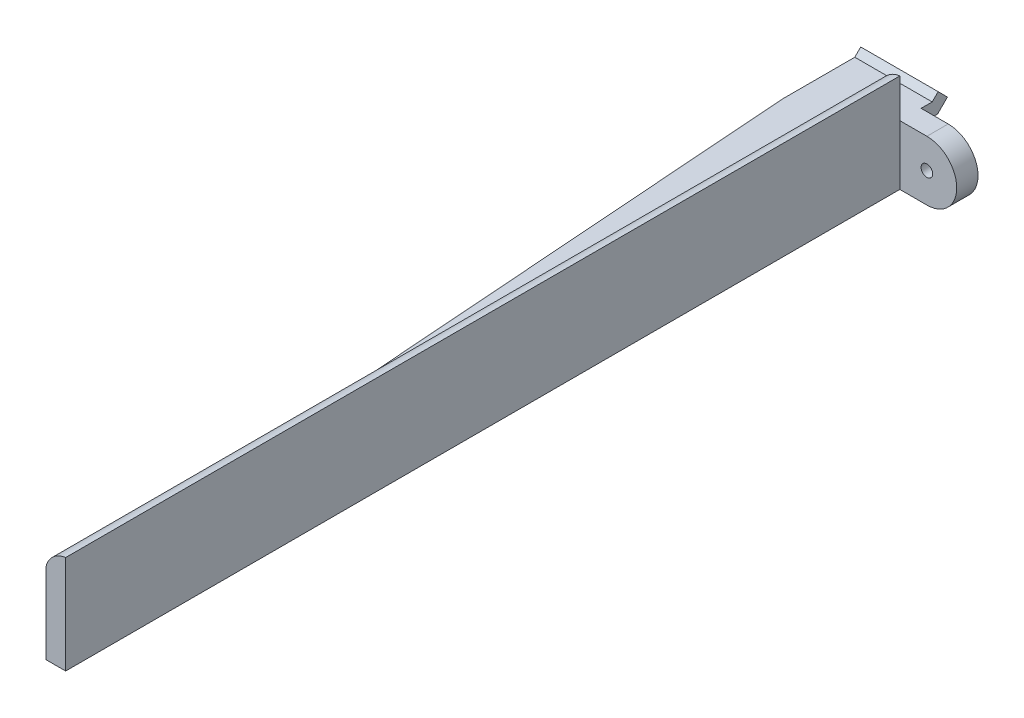
ISO-10303-21;
HEADER;
FILE_DESCRIPTION(('STEP AP214'),'2;1');
FILE_NAME('part.step','',(''),(''),'','','');
FILE_SCHEMA(('AUTOMOTIVE_DESIGN { 1 0 10303 214 1 1 1 1 }'));
ENDSEC;
DATA;
#1=APPLICATION_CONTEXT('core data for automotive mechanical design processes');
#2=APPLICATION_PROTOCOL_DEFINITION('international standard','automotive_design',2000,#1);
#3=PRODUCT_CONTEXT('',#1,'mechanical');
#4=PRODUCT('Part','Part','',(#3));
#5=PRODUCT_RELATED_PRODUCT_CATEGORY('part','',(#4));
#6=PRODUCT_DEFINITION_FORMATION('','',#4);
#7=PRODUCT_DEFINITION_CONTEXT('part definition',#1,'design');
#8=PRODUCT_DEFINITION('design','',#6,#7);
#9=PRODUCT_DEFINITION_SHAPE('','',#8);
#10=(LENGTH_UNIT() NAMED_UNIT(*) SI_UNIT(.MILLI.,.METRE.));
#11=(NAMED_UNIT(*) PLANE_ANGLE_UNIT() SI_UNIT($,.RADIAN.));
#12=(NAMED_UNIT(*) SI_UNIT($,.STERADIAN.) SOLID_ANGLE_UNIT());
#13=UNCERTAINTY_MEASURE_WITH_UNIT(LENGTH_MEASURE(1.E-05),#10,'distance_accuracy_value','');
#14=(GEOMETRIC_REPRESENTATION_CONTEXT(3) GLOBAL_UNCERTAINTY_ASSIGNED_CONTEXT((#13)) GLOBAL_UNIT_ASSIGNED_CONTEXT((#10,
#11,#12)) REPRESENTATION_CONTEXT('',''));
#15=CARTESIAN_POINT('',(0.,0.,0.));
#16=DIRECTION('',(0.,0.,1.));
#17=DIRECTION('',(1.,0.,0.));
#18=AXIS2_PLACEMENT_3D('',#15,#16,#17);
#19=CARTESIAN_POINT('',(9.20199597764665,5.77025558493723,-0.150000000000021));
#20=DIRECTION('',(0.,1.,0.));
#21=DIRECTION('',(0.,0.,1.));
#22=AXIS2_PLACEMENT_3D('',#19,#20,#21);
#23=PLANE('',#22);
#24=DIRECTION('',(-0.0725670682557861,0.,-0.997363534828079));
#25=VECTOR('',#24,1.);
#26=CARTESIAN_POINT('',(-5.,5.77025558493723,7.95281056443287));
#27=LINE('',#26,#25);
#28=CARTESIAN_POINT('',(-0.538779857745085,5.77025558493723,69.2679277060271));
#29=VERTEX_POINT('',#28);
#30=CARTESIAN_POINT('',(-5.,5.77025558493723,7.95281056443287));
#31=VERTEX_POINT('',#30);
#32=EDGE_CURVE('E184',#29,#31,#27,.T.);
#33=ORIENTED_EDGE('',*,*,#32,.F.);
#34=DIRECTION('',(0.,0.,1.));
#35=VECTOR('',#34,1.);
#36=CARTESIAN_POINT('',(-0.538779857745083,5.77025558493723,-0.150000000000021));
#37=LINE('',#36,#35);
#38=CARTESIAN_POINT('',(-0.538779857745082,5.77025558493723,2.74552308366083));
#39=VERTEX_POINT('',#38);
#40=EDGE_CURVE('E316',#29,#39,#37,.F.);
#41=ORIENTED_EDGE('',*,*,#40,.T.);
#42=DIRECTION('',(-1.,0.,0.));
#43=VECTOR('',#42,1.);
#44=CARTESIAN_POINT('',(5.,5.77025558493723,2.74552308366083));
#45=LINE('',#44,#43);
#46=CARTESIAN_POINT('',(5.,5.77025558493723,2.74552308366083));
#47=VERTEX_POINT('',#46);
#48=EDGE_CURVE('E188',#47,#39,#45,.T.);
#49=ORIENTED_EDGE('',*,*,#48,.F.);
#50=DIRECTION('',(0.,0.,-1.));
#51=VECTOR('',#50,1.);
#52=CARTESIAN_POINT('',(5.,5.77025558493723,110.5));
#53=LINE('',#52,#51);
#54=CARTESIAN_POINT('',(5.,5.77025558493723,2.74999999999999));
#55=VERTEX_POINT('',#54);
#56=EDGE_CURVE('E183',#55,#47,#53,.T.);
#57=ORIENTED_EDGE('',*,*,#56,.F.);
#58=DIRECTION('',(-1.,0.,0.));
#59=VECTOR('',#58,1.);
#60=CARTESIAN_POINT('',(5.,5.7702555849373,2.75));
#61=LINE('',#60,#59);
#62=CARTESIAN_POINT('',(8.5,5.7702555849373,2.75));
#63=VERTEX_POINT('',#62);
#64=EDGE_CURVE('E204',#63,#55,#61,.T.);
#65=ORIENTED_EDGE('',*,*,#64,.F.);
#66=DIRECTION('',(0.,0.,-1.));
#67=VECTOR('',#66,1.);
#68=CARTESIAN_POINT('',(8.5,5.7702555849373,13.3948344279941));
#69=LINE('',#68,#67);
#70=CARTESIAN_POINT('',(8.5,5.7702555849373,0.));
#71=VERTEX_POINT('',#70);
#72=EDGE_CURVE('E231',#63,#71,#69,.T.);
#73=ORIENTED_EDGE('',*,*,#72,.T.);
#74=DIRECTION('',(-1.,0.,0.));
#75=VECTOR('',#74,1.);
#76=CARTESIAN_POINT('',(5.,5.7702555849373,0.));
#77=LINE('',#76,#75);
#78=CARTESIAN_POINT('',(5.,5.77025558493723,0.));
#79=VERTEX_POINT('',#78);
#80=EDGE_CURVE('E228',#71,#79,#77,.T.);
#81=ORIENTED_EDGE('',*,*,#80,.T.);
#82=DIRECTION('',(0.,0.,1.));
#83=VECTOR('',#82,1.);
#84=CARTESIAN_POINT('',(5.,5.77025558493723,-0.150000000000021));
#85=LINE('',#84,#83);
#86=CARTESIAN_POINT('',(5.,5.77025558493723,-1.43370490960982));
#87=VERTEX_POINT('',#86);
#88=EDGE_CURVE('E285',#87,#79,#85,.T.);
#89=ORIENTED_EDGE('',*,*,#88,.F.);
#90=DIRECTION('',(-1.,0.,0.));
#91=VECTOR('',#90,1.);
#92=CARTESIAN_POINT('',(9.20199597764665,5.77025558493723,-1.43370490960982));
#93=LINE('',#92,#91);
#94=CARTESIAN_POINT('',(-5.,5.77025558493723,-1.43370490960982));
#95=VERTEX_POINT('',#94);
#96=EDGE_CURVE('E299',#87,#95,#93,.T.);
#97=ORIENTED_EDGE('',*,*,#96,.T.);
#98=DIRECTION('',(0.,0.,-1.));
#99=VECTOR('',#98,1.);
#100=CARTESIAN_POINT('',(-5.,5.77025558493723,-0.150000000000021));
#101=LINE('',#100,#99);
#102=EDGE_CURVE('E275',#31,#95,#101,.T.);
#103=ORIENTED_EDGE('',*,*,#102,.F.);
#104=EDGE_LOOP('',(#33,#41,#49,#57,#65,#73,#81,#89,#97,#103));
#105=FACE_BOUND('',#104,.T.);
#106=ADVANCED_FACE('F33',(#105),#23,.T.);
#107=CARTESIAN_POINT('',(5.,-5.8181568544759,5.));
#108=DIRECTION('',(-1.,0.,0.));
#109=DIRECTION('',(0.,0.,1.));
#110=AXIS2_PLACEMENT_3D('',#107,#108,#109);
#111=PLANE('',#110);
#112=ORIENTED_EDGE('',*,*,#88,.T.);
#113=DIRECTION('',(0.,-1.,0.));
#114=VECTOR('',#113,1.);
#115=CARTESIAN_POINT('',(5.,-1.92974441503669,0.));
#116=LINE('',#115,#114);
#117=CARTESIAN_POINT('',(5.,4.07025558493731,0.));
#118=VERTEX_POINT('',#117);
#119=EDGE_CURVE('E220',#79,#118,#116,.T.);
#120=ORIENTED_EDGE('',*,*,#119,.T.);
#121=DIRECTION('',(0.,-4.68375338513673E-13,-1.));
#122=VECTOR('',#121,1.);
#123=CARTESIAN_POINT('',(5.,4.07025558493731,0.));
#124=LINE('',#123,#122);
#125=CARTESIAN_POINT('',(5.,4.07025558493724,-2.13786796564408));
#126=VERTEX_POINT('',#125);
#127=EDGE_CURVE('E283',#118,#126,#124,.T.);
#128=ORIENTED_EDGE('',*,*,#127,.T.);
#129=DIRECTION('',(0.,0.707106781186549,-0.707106781186546));
#130=VECTOR('',#129,1.);
#131=CARTESIAN_POINT('',(5.,5.33446914731033,-3.40208152801718));
#132=LINE('',#131,#130);
#133=CARTESIAN_POINT('',(5.,5.33446914731033,-3.40208152801717));
#134=VERTEX_POINT('',#133);
#135=EDGE_CURVE('E281',#126,#134,#132,.T.);
#136=ORIENTED_EDGE('',*,*,#135,.T.);
#137=DIRECTION('',(0.,0.707106781186546,0.707106781186549));
#138=VECTOR('',#137,1.);
#139=CARTESIAN_POINT('',(5.,6.53655067532746,-2.20000000000005));
#140=LINE('',#139,#138);
#141=CARTESIAN_POINT('',(5.,6.53655067532746,-2.20000000000005));
#142=VERTEX_POINT('',#141);
#143=EDGE_CURVE('E278',#134,#142,#140,.T.);
#144=ORIENTED_EDGE('',*,*,#143,.T.);
#145=DIRECTION('',(0.,-0.707106781186546,0.707106781186549));
#146=VECTOR('',#145,1.);
#147=CARTESIAN_POINT('',(5.,5.77025558493723,-1.43370490960982));
#148=LINE('',#147,#146);
#149=EDGE_CURVE('E276',#142,#87,#148,.T.);
#150=ORIENTED_EDGE('',*,*,#149,.T.);
#151=EDGE_LOOP('',(#112,#120,#128,#136,#144,#150));
#152=FACE_BOUND('',#151,.T.);
#153=ADVANCED_FACE('F374',(#152),#111,.F.);
#154=DIRECTION('',(0.,0.,1.));
#155=VECTOR('',#154,1.);
#156=CARTESIAN_POINT('',(5.,-0.229744415062765,-0.150000000000021));
#157=LINE('',#156,#155);
#158=CARTESIAN_POINT('',(5.,-0.229744415062765,-1.43370490960982));
#159=VERTEX_POINT('',#158);
#160=CARTESIAN_POINT('',(5.,-0.229744415062766,0.));
#161=VERTEX_POINT('',#160);
#162=EDGE_CURVE('E248',#159,#161,#157,.T.);
#163=ORIENTED_EDGE('',*,*,#162,.T.);
#164=CARTESIAN_POINT('',(5.,-1.92974441503669,0.));
#165=VERTEX_POINT('',#164);
#166=EDGE_CURVE('E219',#161,#165,#116,.T.);
#167=ORIENTED_EDGE('',*,*,#166,.T.);
#168=DIRECTION('',(0.,-4.66929735617026E-13,-1.));
#169=VECTOR('',#168,1.);
#170=CARTESIAN_POINT('',(5.,-1.92974441506276,-0.150000000000021));
#171=LINE('',#170,#169);
#172=CARTESIAN_POINT('',(5.,-1.92974441506276,-2.13786796564409));
#173=VERTEX_POINT('',#172);
#174=EDGE_CURVE('E245',#165,#173,#171,.T.);
#175=ORIENTED_EDGE('',*,*,#174,.T.);
#176=DIRECTION('',(0.,0.707106781186549,-0.707106781186546));
#177=VECTOR('',#176,1.);
#178=CARTESIAN_POINT('',(5.,-0.66553085268967,-3.40208152801718));
#179=LINE('',#178,#177);
#180=CARTESIAN_POINT('',(5.,-0.66553085268967,-3.40208152801718));
#181=VERTEX_POINT('',#180);
#182=EDGE_CURVE('E243',#173,#181,#179,.T.);
#183=ORIENTED_EDGE('',*,*,#182,.T.);
#184=DIRECTION('',(0.,0.707106781186547,0.707106781186548));
#185=VECTOR('',#184,1.);
#186=CARTESIAN_POINT('',(5.,0.53655067532746,-2.20000000000005));
#187=LINE('',#186,#185);
#188=CARTESIAN_POINT('',(5.,0.53655067532746,-2.20000000000005));
#189=VERTEX_POINT('',#188);
#190=EDGE_CURVE('E240',#181,#189,#187,.T.);
#191=ORIENTED_EDGE('',*,*,#190,.T.);
#192=DIRECTION('',(0.,-0.707106781186546,0.707106781186549));
#193=VECTOR('',#192,1.);
#194=CARTESIAN_POINT('',(5.,-0.229744415062765,-1.43370490960982));
#195=LINE('',#194,#193);
#196=EDGE_CURVE('E238',#189,#159,#195,.T.);
#197=ORIENTED_EDGE('',*,*,#196,.T.);
#198=EDGE_LOOP('',(#163,#167,#175,#183,#191,#197));
#199=FACE_BOUND('',#198,.T.);
#200=ADVANCED_FACE('F349',(#199),#111,.F.);
#201=DIRECTION('',(0.,-1.,0.));
#202=VECTOR('',#201,1.);
#203=CARTESIAN_POINT('',(5.,-1.92974441503669,2.75));
#204=LINE('',#203,#202);
#205=CARTESIAN_POINT('',(5.,-1.92974441506141,2.75));
#206=VERTEX_POINT('',#205);
#207=EDGE_CURVE('E213',#55,#206,#204,.T.);
#208=ORIENTED_EDGE('',*,*,#207,.F.);
#209=ORIENTED_EDGE('',*,*,#56,.T.);
#210=DIRECTION('',(0.,-1.,0.));
#211=VECTOR('',#210,1.);
#212=CARTESIAN_POINT('',(5.,10.7702555849372,2.74552308366083));
#213=LINE('',#212,#211);
#214=CARTESIAN_POINT('',(5.,10.7702555849372,2.74552308366083));
#215=VERTEX_POINT('',#214);
#216=EDGE_CURVE('E172',#215,#47,#213,.T.);
#217=ORIENTED_EDGE('',*,*,#216,.F.);
#218=DIRECTION('',(0.,0.,-1.));
#219=VECTOR('',#218,1.);
#220=CARTESIAN_POINT('',(5.,10.7702555849372,110.5));
#221=LINE('',#220,#219);
#222=CARTESIAN_POINT('',(5.,10.7702555849372,110.5));
#223=VERTEX_POINT('',#222);
#224=EDGE_CURVE('E182',#223,#215,#221,.T.);
#225=ORIENTED_EDGE('',*,*,#224,.F.);
#226=DIRECTION('',(0.,1.,0.));
#227=VECTOR('',#226,1.);
#228=CARTESIAN_POINT('',(5.,5.77025558493729,110.5));
#229=LINE('',#228,#227);
#230=CARTESIAN_POINT('',(5.,-1.92974441505779,110.5));
#231=VERTEX_POINT('',#230);
#232=EDGE_CURVE('E201',#231,#223,#229,.T.);
#233=ORIENTED_EDGE('',*,*,#232,.F.);
#234=EDGE_CURVE('E246',#231,#206,#171,.T.);
#235=ORIENTED_EDGE('',*,*,#234,.T.);
#236=EDGE_LOOP('',(#208,#209,#217,#225,#233,#235));
#237=FACE_BOUND('',#236,.T.);
#238=ADVANCED_FACE('F180',(#237),#111,.F.);
#239=CARTESIAN_POINT('',(-5.,-5.8181568544759,5.));
#240=DIRECTION('',(1.,0.,0.));
#241=DIRECTION('',(0.,0.,-1.));
#242=AXIS2_PLACEMENT_3D('',#239,#240,#241);
#243=PLANE('',#242);
#244=DIRECTION('',(0.,4.66929735617026E-13,1.));
#245=VECTOR('',#244,1.);
#246=CARTESIAN_POINT('',(-5.,-1.92974441506276,-0.150000000000021));
#247=LINE('',#246,#245);
#248=CARTESIAN_POINT('',(-5.,-1.92974441506276,-2.13786796564409));
#249=VERTEX_POINT('',#248);
#250=CARTESIAN_POINT('',(-5.,-1.92974441503505,7.95281056443287));
#251=VERTEX_POINT('',#250);
#252=EDGE_CURVE('E260',#249,#251,#247,.T.);
#253=ORIENTED_EDGE('',*,*,#252,.T.);
#254=DIRECTION('',(0.,1.,0.));
#255=VECTOR('',#254,1.);
#256=CARTESIAN_POINT('',(-5.,-94.2297444150628,7.95281056443287));
#257=LINE('',#256,#255);
#258=EDGE_CURVE('E194',#251,#31,#257,.T.);
#259=ORIENTED_EDGE('',*,*,#258,.T.);
#260=ORIENTED_EDGE('',*,*,#102,.T.);
#261=DIRECTION('',(0.,0.707106781186546,-0.707106781186549));
#262=VECTOR('',#261,1.);
#263=CARTESIAN_POINT('',(-5.,5.77025558493723,-1.43370490960982));
#264=LINE('',#263,#262);
#265=CARTESIAN_POINT('',(-5.,6.53655067532746,-2.20000000000005));
#266=VERTEX_POINT('',#265);
#267=EDGE_CURVE('E287',#95,#266,#264,.T.);
#268=ORIENTED_EDGE('',*,*,#267,.T.);
#269=DIRECTION('',(0.,-0.707106781186546,-0.707106781186549));
#270=VECTOR('',#269,1.);
#271=CARTESIAN_POINT('',(-5.,6.53655067532746,-2.20000000000005));
#272=LINE('',#271,#270);
#273=CARTESIAN_POINT('',(-5.,5.33446914731033,-3.40208152801718));
#274=VERTEX_POINT('',#273);
#275=EDGE_CURVE('E290',#266,#274,#272,.T.);
#276=ORIENTED_EDGE('',*,*,#275,.T.);
#277=DIRECTION('',(0.,-0.707106781186549,0.707106781186546));
#278=VECTOR('',#277,1.);
#279=CARTESIAN_POINT('',(-5.,5.33446914731033,-3.40208152801718));
#280=LINE('',#279,#278);
#281=CARTESIAN_POINT('',(-5.,4.07025558493724,-2.13786796564408));
#282=VERTEX_POINT('',#281);
#283=EDGE_CURVE('E293',#274,#282,#280,.T.);
#284=ORIENTED_EDGE('',*,*,#283,.T.);
#285=DIRECTION('',(0.,4.68375338513673E-13,1.));
#286=VECTOR('',#285,1.);
#287=CARTESIAN_POINT('',(-5.,4.07025558493731,0.));
#288=LINE('',#287,#286);
#289=CARTESIAN_POINT('',(-5.,4.07025558493731,0.));
#290=VERTEX_POINT('',#289);
#291=EDGE_CURVE('E296',#282,#290,#288,.T.);
#292=ORIENTED_EDGE('',*,*,#291,.T.);
#293=DIRECTION('',(0.,-1.,0.));
#294=VECTOR('',#293,1.);
#295=CARTESIAN_POINT('',(-5.,-5.8181568544759,0.));
#296=LINE('',#295,#294);
#297=CARTESIAN_POINT('',(-5.,-0.229744415062696,0.));
#298=VERTEX_POINT('',#297);
#299=EDGE_CURVE('E311',#290,#298,#296,.T.);
#300=ORIENTED_EDGE('',*,*,#299,.T.);
#301=DIRECTION('',(0.,0.,-1.));
#302=VECTOR('',#301,1.);
#303=CARTESIAN_POINT('',(-5.,-0.229744415062765,-0.150000000000021));
#304=LINE('',#303,#302);
#305=CARTESIAN_POINT('',(-5.,-0.229744415062765,-1.43370490960982));
#306=VERTEX_POINT('',#305);
#307=EDGE_CURVE('E235',#298,#306,#304,.T.);
#308=ORIENTED_EDGE('',*,*,#307,.T.);
#309=DIRECTION('',(0.,0.707106781186546,-0.707106781186549));
#310=VECTOR('',#309,1.);
#311=CARTESIAN_POINT('',(-5.,-0.229744415062765,-1.43370490960982));
#312=LINE('',#311,#310);
#313=CARTESIAN_POINT('',(-5.,0.53655067532746,-2.20000000000005));
#314=VERTEX_POINT('',#313);
#315=EDGE_CURVE('E251',#306,#314,#312,.T.);
#316=ORIENTED_EDGE('',*,*,#315,.T.);
#317=DIRECTION('',(0.,-0.707106781186547,-0.707106781186548));
#318=VECTOR('',#317,1.);
#319=CARTESIAN_POINT('',(-5.,0.53655067532746,-2.20000000000005));
#320=LINE('',#319,#318);
#321=CARTESIAN_POINT('',(-5.,-0.66553085268967,-3.40208152801718));
#322=VERTEX_POINT('',#321);
#323=EDGE_CURVE('E254',#314,#322,#320,.T.);
#324=ORIENTED_EDGE('',*,*,#323,.T.);
#325=DIRECTION('',(0.,-0.707106781186549,0.707106781186546));
#326=VECTOR('',#325,1.);
#327=CARTESIAN_POINT('',(-5.,-0.66553085268967,-3.40208152801718));
#328=LINE('',#327,#326);
#329=EDGE_CURVE('E257',#322,#249,#328,.T.);
#330=ORIENTED_EDGE('',*,*,#329,.T.);
#331=EDGE_LOOP('',(#253,#259,#260,#268,#276,#284,#292,#300,#308,#316,#324,#330));
#332=FACE_BOUND('',#331,.T.);
#333=ADVANCED_FACE('F335',(#332),#243,.F.);
#334=CARTESIAN_POINT('',(0.,0.,0.));
#335=DIRECTION('',(0.,0.,-1.));
#336=DIRECTION('',(-1.,0.,0.));
#337=AXIS2_PLACEMENT_3D('',#334,#335,#336);
#338=PLANE('',#337);
#339=DIRECTION('',(-1.,0.,0.));
#340=VECTOR('',#339,1.);
#341=CARTESIAN_POINT('',(9.20199597764665,-0.229744415062696,0.));
#342=LINE('',#341,#340);
#343=EDGE_CURVE('E263',#161,#298,#342,.T.);
#344=ORIENTED_EDGE('',*,*,#343,.T.);
#345=ORIENTED_EDGE('',*,*,#299,.F.);
#346=DIRECTION('',(-1.,0.,0.));
#347=VECTOR('',#346,1.);
#348=CARTESIAN_POINT('',(9.20199597764665,4.07025558493731,0.));
#349=LINE('',#348,#347);
#350=EDGE_CURVE('E279',#118,#290,#349,.T.);
#351=ORIENTED_EDGE('',*,*,#350,.F.);
#352=ORIENTED_EDGE('',*,*,#119,.F.);
#353=ORIENTED_EDGE('',*,*,#80,.F.);
#354=CARTESIAN_POINT('',(8.5,1.92025558495027,0.));
#355=DIRECTION('',(0.,0.,1.));
#356=DIRECTION('',(-1.,0.,0.));
#357=AXIS2_PLACEMENT_3D('',#354,#355,#356);
#358=CIRCLE('',#357,3.84999999998699);
#359=CARTESIAN_POINT('',(8.5,-1.92974441503672,0.));
#360=VERTEX_POINT('',#359);
#361=EDGE_CURVE('E225',#360,#71,#358,.T.);
#362=ORIENTED_EDGE('',*,*,#361,.F.);
#363=DIRECTION('',(1.,0.,0.));
#364=VECTOR('',#363,1.);
#365=CARTESIAN_POINT('',(8.5,-1.92974441503669,0.));
#366=LINE('',#365,#364);
#367=EDGE_CURVE('E222',#165,#360,#366,.T.);
#368=ORIENTED_EDGE('',*,*,#367,.F.);
#369=ORIENTED_EDGE('',*,*,#166,.F.);
#370=EDGE_LOOP('',(#344,#345,#351,#352,#353,#362,#368,#369));
#371=FACE_BOUND('',#370,.T.);
#372=CARTESIAN_POINT('',(8.5,1.92025558495027,0.));
#373=DIRECTION('',(0.,0.,1.));
#374=DIRECTION('',(1.,0.,0.));
#375=AXIS2_PLACEMENT_3D('',#372,#373,#374);
#376=CIRCLE('',#375,0.749999999998547);
#377=CARTESIAN_POINT('',(9.24999999999855,1.92025558495027,0.));
#378=VERTEX_POINT('',#377);
#379=EDGE_CURVE('E216',#378,#378,#376,.T.);
#380=ORIENTED_EDGE('',*,*,#379,.T.);
#381=EDGE_LOOP('',(#380));
#382=FACE_BOUND('',#381,.T.);
#383=ADVANCED_FACE('F352',(#371,#382),#338,.T.);
#384=CARTESIAN_POINT('',(9.20199597764665,4.07025558493731,0.));
#385=DIRECTION('',(0.,-1.,4.68375338513673E-13));
#386=DIRECTION('',(0.,-4.68375338513673E-13,-1.));
#387=AXIS2_PLACEMENT_3D('',#384,#385,#386);
#388=PLANE('',#387);
#389=ORIENTED_EDGE('',*,*,#127,.F.);
#390=ORIENTED_EDGE('',*,*,#350,.T.);
#391=ORIENTED_EDGE('',*,*,#291,.F.);
#392=DIRECTION('',(-1.,0.,0.));
#393=VECTOR('',#392,1.);
#394=CARTESIAN_POINT('',(9.20199597764665,4.07025558493724,-2.13786796564408));
#395=LINE('',#394,#393);
#396=EDGE_CURVE('E302',#126,#282,#395,.T.);
#397=ORIENTED_EDGE('',*,*,#396,.F.);
#398=EDGE_LOOP('',(#389,#390,#391,#397));
#399=FACE_BOUND('',#398,.T.);
#400=ADVANCED_FACE('F386',(#399),#388,.T.);
#401=CARTESIAN_POINT('',(9.20199597764665,5.33446914731033,-3.40208152801718));
#402=DIRECTION('',(0.,-0.707106781186546,-0.707106781186549));
#403=DIRECTION('',(0.,0.707106781186549,-0.707106781186546));
#404=AXIS2_PLACEMENT_3D('',#401,#402,#403);
#405=PLANE('',#404);
#406=ORIENTED_EDGE('',*,*,#135,.F.);
#407=ORIENTED_EDGE('',*,*,#396,.T.);
#408=ORIENTED_EDGE('',*,*,#283,.F.);
#409=DIRECTION('',(-1.,0.,0.));
#410=VECTOR('',#409,1.);
#411=CARTESIAN_POINT('',(9.20199597764665,5.33446914731033,-3.40208152801718));
#412=LINE('',#411,#410);
#413=EDGE_CURVE('E304',#134,#274,#412,.T.);
#414=ORIENTED_EDGE('',*,*,#413,.F.);
#415=EDGE_LOOP('',(#406,#407,#408,#414));
#416=FACE_BOUND('',#415,.T.);
#417=ADVANCED_FACE('F453',(#416),#405,.T.);
#418=CARTESIAN_POINT('',(9.20199597764665,6.53655067532746,-2.20000000000005));
#419=DIRECTION('',(0.,0.707106781186549,-0.707106781186546));
#420=DIRECTION('',(0.,0.707106781186546,0.707106781186549));
#421=AXIS2_PLACEMENT_3D('',#418,#419,#420);
#422=PLANE('',#421);
#423=ORIENTED_EDGE('',*,*,#143,.F.);
#424=ORIENTED_EDGE('',*,*,#413,.T.);
#425=ORIENTED_EDGE('',*,*,#275,.F.);
#426=DIRECTION('',(-1.,0.,0.));
#427=VECTOR('',#426,1.);
#428=CARTESIAN_POINT('',(9.20199597764665,6.53655067532746,-2.20000000000005));
#429=LINE('',#428,#427);
#430=EDGE_CURVE('E306',#142,#266,#429,.T.);
#431=ORIENTED_EDGE('',*,*,#430,.F.);
#432=EDGE_LOOP('',(#423,#424,#425,#431));
#433=FACE_BOUND('',#432,.T.);
#434=ADVANCED_FACE('F443',(#433),#422,.T.);
#435=CARTESIAN_POINT('',(9.20199597764665,5.77025558493723,-1.43370490960982));
#436=DIRECTION('',(0.,0.707106781186549,0.707106781186546));
#437=DIRECTION('',(0.,-0.707106781186546,0.707106781186549));
#438=AXIS2_PLACEMENT_3D('',#435,#436,#437);
#439=PLANE('',#438);
#440=ORIENTED_EDGE('',*,*,#149,.F.);
#441=ORIENTED_EDGE('',*,*,#430,.T.);
#442=ORIENTED_EDGE('',*,*,#267,.F.);
#443=ORIENTED_EDGE('',*,*,#96,.F.);
#444=EDGE_LOOP('',(#440,#441,#442,#443));
#445=FACE_BOUND('',#444,.T.);
#446=ADVANCED_FACE('F382',(#445),#439,.T.);
#447=CARTESIAN_POINT('',(9.20199597764665,-1.92974441506276,-0.150000000000021));
#448=DIRECTION('',(0.,-1.,4.66929735617026E-13));
#449=DIRECTION('',(0.,-4.66929735617026E-13,-1.));
#450=AXIS2_PLACEMENT_3D('',#447,#448,#449);
#451=PLANE('',#450);
#452=DIRECTION('',(0.0725670682557861,4.65698691631337E-13,0.997363534828079));
#453=VECTOR('',#452,1.);
#454=CARTESIAN_POINT('',(-5.51165955494513,-1.92974441506226,0.920549311299757));
#455=LINE('',#454,#453);
#456=CARTESIAN_POINT('',(2.46122014225492,-1.92974441505779,110.5));
#457=VERTEX_POINT('',#456);
#458=EDGE_CURVE('E197',#251,#457,#455,.T.);
#459=ORIENTED_EDGE('',*,*,#458,.F.);
#460=ORIENTED_EDGE('',*,*,#252,.F.);
#461=DIRECTION('',(-1.,0.,0.));
#462=VECTOR('',#461,1.);
#463=CARTESIAN_POINT('',(9.20199597764665,-1.92974441506276,-2.13786796564409));
#464=LINE('',#463,#462);
#465=EDGE_CURVE('E241',#173,#249,#464,.T.);
#466=ORIENTED_EDGE('',*,*,#465,.F.);
#467=ORIENTED_EDGE('',*,*,#174,.F.);
#468=ORIENTED_EDGE('',*,*,#367,.T.);
#469=DIRECTION('',(0.,0.,-1.));
#470=VECTOR('',#469,1.);
#471=CARTESIAN_POINT('',(8.5,-1.92974441503672,13.3948344279941));
#472=LINE('',#471,#470);
#473=CARTESIAN_POINT('',(8.5,-1.92974441503672,2.75));
#474=VERTEX_POINT('',#473);
#475=EDGE_CURVE('E233',#474,#360,#472,.T.);
#476=ORIENTED_EDGE('',*,*,#475,.F.);
#477=DIRECTION('',(1.,0.,0.));
#478=VECTOR('',#477,1.);
#479=CARTESIAN_POINT('',(8.5,-1.92974441503669,2.75));
#480=LINE('',#479,#478);
#481=EDGE_CURVE('E210',#206,#474,#480,.T.);
#482=ORIENTED_EDGE('',*,*,#481,.F.);
#483=ORIENTED_EDGE('',*,*,#234,.F.);
#484=DIRECTION('',(1.,0.,0.));
#485=VECTOR('',#484,1.);
#486=CARTESIAN_POINT('',(-5.,-1.92974441505779,110.5));
#487=LINE('',#486,#485);
#488=EDGE_CURVE('E199',#457,#231,#487,.T.);
#489=ORIENTED_EDGE('',*,*,#488,.F.);
#490=EDGE_LOOP('',(#459,#460,#466,#467,#468,#476,#482,#483,#489));
#491=FACE_BOUND('',#490,.T.);
#492=ADVANCED_FACE('F331',(#491),#451,.T.);
#493=CARTESIAN_POINT('',(9.20199597764665,-0.66553085268967,-3.40208152801718));
#494=DIRECTION('',(0.,-0.707106781186546,-0.707106781186549));
#495=DIRECTION('',(0.,0.707106781186549,-0.707106781186546));
#496=AXIS2_PLACEMENT_3D('',#493,#494,#495);
#497=PLANE('',#496);
#498=ORIENTED_EDGE('',*,*,#182,.F.);
#499=ORIENTED_EDGE('',*,*,#465,.T.);
#500=ORIENTED_EDGE('',*,*,#329,.F.);
#501=DIRECTION('',(-1.,0.,0.));
#502=VECTOR('',#501,1.);
#503=CARTESIAN_POINT('',(9.20199597764665,-0.66553085268967,-3.40208152801718));
#504=LINE('',#503,#502);
#505=EDGE_CURVE('E265',#181,#322,#504,.T.);
#506=ORIENTED_EDGE('',*,*,#505,.F.);
#507=EDGE_LOOP('',(#498,#499,#500,#506));
#508=FACE_BOUND('',#507,.T.);
#509=ADVANCED_FACE('F342',(#508),#497,.T.);
#510=CARTESIAN_POINT('',(9.20199597764665,0.53655067532746,-2.20000000000005));
#511=DIRECTION('',(0.,0.707106781186548,-0.707106781186547));
#512=DIRECTION('',(0.,0.707106781186547,0.707106781186548));
#513=AXIS2_PLACEMENT_3D('',#510,#511,#512);
#514=PLANE('',#513);
#515=ORIENTED_EDGE('',*,*,#190,.F.);
#516=ORIENTED_EDGE('',*,*,#505,.T.);
#517=ORIENTED_EDGE('',*,*,#323,.F.);
#518=DIRECTION('',(-1.,0.,0.));
#519=VECTOR('',#518,1.);
#520=CARTESIAN_POINT('',(9.20199597764665,0.53655067532746,-2.20000000000005));
#521=LINE('',#520,#519);
#522=EDGE_CURVE('E267',#189,#314,#521,.T.);
#523=ORIENTED_EDGE('',*,*,#522,.F.);
#524=EDGE_LOOP('',(#515,#516,#517,#523));
#525=FACE_BOUND('',#524,.T.);
#526=ADVANCED_FACE('F412',(#525),#514,.T.);
#527=CARTESIAN_POINT('',(9.20199597764665,-0.229744415062765,-1.43370490960982));
#528=DIRECTION('',(0.,0.707106781186549,0.707106781186546));
#529=DIRECTION('',(0.,-0.707106781186546,0.707106781186549));
#530=AXIS2_PLACEMENT_3D('',#527,#528,#529);
#531=PLANE('',#530);
#532=ORIENTED_EDGE('',*,*,#196,.F.);
#533=ORIENTED_EDGE('',*,*,#522,.T.);
#534=ORIENTED_EDGE('',*,*,#315,.F.);
#535=DIRECTION('',(-1.,0.,0.));
#536=VECTOR('',#535,1.);
#537=CARTESIAN_POINT('',(9.20199597764665,-0.229744415062765,-1.43370490960982));
#538=LINE('',#537,#536);
#539=EDGE_CURVE('E269',#159,#306,#538,.T.);
#540=ORIENTED_EDGE('',*,*,#539,.F.);
#541=EDGE_LOOP('',(#532,#533,#534,#540));
#542=FACE_BOUND('',#541,.T.);
#543=ADVANCED_FACE('F406',(#542),#531,.T.);
#544=CARTESIAN_POINT('',(9.20199597764665,-0.229744415062765,-0.150000000000021));
#545=DIRECTION('',(0.,1.,0.));
#546=DIRECTION('',(0.,0.,1.));
#547=AXIS2_PLACEMENT_3D('',#544,#545,#546);
#548=PLANE('',#547);
#549=ORIENTED_EDGE('',*,*,#162,.F.);
#550=ORIENTED_EDGE('',*,*,#539,.T.);
#551=ORIENTED_EDGE('',*,*,#307,.F.);
#552=ORIENTED_EDGE('',*,*,#343,.F.);
#553=EDGE_LOOP('',(#549,#550,#551,#552));
#554=FACE_BOUND('',#553,.T.);
#555=ADVANCED_FACE('F411',(#554),#548,.T.);
#556=CARTESIAN_POINT('',(8.5,1.92025558495027,13.3948344279941));
#557=DIRECTION('',(0.,0.,-1.));
#558=DIRECTION('',(-1.,0.,0.));
#559=AXIS2_PLACEMENT_3D('',#556,#557,#558);
#560=CYLINDRICAL_SURFACE('',#559,3.84999999998699);
#561=CARTESIAN_POINT('',(8.5,1.92025558495027,2.75));
#562=DIRECTION('',(0.,0.,1.));
#563=DIRECTION('',(1.,0.,0.));
#564=AXIS2_PLACEMENT_3D('',#561,#562,#563);
#565=CIRCLE('',#564,3.84999999998699);
#566=EDGE_CURVE('E207',#474,#63,#565,.T.);
#567=ORIENTED_EDGE('',*,*,#566,.F.);
#568=ORIENTED_EDGE('',*,*,#475,.T.);
#569=ORIENTED_EDGE('',*,*,#361,.T.);
#570=ORIENTED_EDGE('',*,*,#72,.F.);
#571=EDGE_LOOP('',(#567,#568,#569,#570));
#572=FACE_BOUND('',#571,.T.);
#573=ADVANCED_FACE('F357',(#572),#560,.T.);
#574=CARTESIAN_POINT('',(8.5,1.92025558495027,13.3948344279941));
#575=DIRECTION('',(0.,0.,-1.));
#576=DIRECTION('',(-1.,0.,0.));
#577=AXIS2_PLACEMENT_3D('',#574,#575,#576);
#578=CYLINDRICAL_SURFACE('',#577,0.749999999998547);
#579=ORIENTED_EDGE('',*,*,#379,.F.);
#580=EDGE_LOOP('',(#579));
#581=FACE_BOUND('',#580,.T.);
#582=CARTESIAN_POINT('',(8.5,1.92025558495027,2.75));
#583=DIRECTION('',(0.,0.,1.));
#584=DIRECTION('',(1.,0.,0.));
#585=AXIS2_PLACEMENT_3D('',#582,#583,#584);
#586=CIRCLE('',#585,0.749999999998547);
#587=CARTESIAN_POINT('',(9.24999999999855,1.92025558495027,2.75));
#588=VERTEX_POINT('',#587);
#589=EDGE_CURVE('E203',#588,#588,#586,.T.);
#590=ORIENTED_EDGE('',*,*,#589,.T.);
#591=EDGE_LOOP('',(#590));
#592=FACE_BOUND('',#591,.T.);
#593=ADVANCED_FACE('F487',(#581,#592),#578,.F.);
#594=CARTESIAN_POINT('',(0.,0.,2.75));
#595=DIRECTION('',(0.,0.,1.));
#596=DIRECTION('',(1.,0.,0.));
#597=AXIS2_PLACEMENT_3D('',#594,#595,#596);
#598=PLANE('',#597);
#599=ORIENTED_EDGE('',*,*,#589,.F.);
#600=EDGE_LOOP('',(#599));
#601=FACE_BOUND('',#600,.T.);
#602=ORIENTED_EDGE('',*,*,#64,.T.);
#603=ORIENTED_EDGE('',*,*,#207,.T.);
#604=ORIENTED_EDGE('',*,*,#481,.T.);
#605=ORIENTED_EDGE('',*,*,#566,.T.);
#606=EDGE_LOOP('',(#602,#603,#604,#605));
#607=FACE_BOUND('',#606,.T.);
#608=ADVANCED_FACE('F361',(#601,#607),#598,.T.);
#609=CARTESIAN_POINT('',(0.,0.,110.5));
#610=DIRECTION('',(0.,0.,1.));
#611=DIRECTION('',(1.,0.,0.));
#612=AXIS2_PLACEMENT_3D('',#609,#610,#611);
#613=PLANE('',#612);
#614=ORIENTED_EDGE('',*,*,#232,.T.);
#615=CARTESIAN_POINT('',(5.3813623862342,7.79459385510876,110.5));
#616=DIRECTION('',(0.,0.,1.));
#617=DIRECTION('',(1.,0.,0.));
#618=AXIS2_PLACEMENT_3D('',#615,#616,#617);
#619=CIRCLE('',#618,3.);
#620=CARTESIAN_POINT('',(2.46122014225492,8.48217605014264,110.5));
#621=VERTEX_POINT('',#620);
#622=EDGE_CURVE('E186',#223,#621,#619,.T.);
#623=ORIENTED_EDGE('',*,*,#622,.T.);
#624=DIRECTION('',(0.,1.,0.));
#625=VECTOR('',#624,1.);
#626=CARTESIAN_POINT('',(2.46122014225492,0.,110.5));
#627=LINE('',#626,#625);
#628=EDGE_CURVE('E314',#457,#621,#627,.T.);
#629=ORIENTED_EDGE('',*,*,#628,.F.);
#630=ORIENTED_EDGE('',*,*,#488,.T.);
#631=EDGE_LOOP('',(#614,#623,#629,#630));
#632=FACE_BOUND('',#631,.T.);
#633=ADVANCED_FACE('F325',(#632),#613,.T.);
#634=CARTESIAN_POINT('',(-5.,-94.2297444150628,7.95281056443287));
#635=DIRECTION('',(0.997363534828079,0.,-0.0725670682557861));
#636=DIRECTION('',(-0.0725670682557861,0.,-0.997363534828079));
#637=AXIS2_PLACEMENT_3D('',#634,#635,#636);
#638=PLANE('',#637);
#639=ORIENTED_EDGE('',*,*,#628,.T.);
#640=CARTESIAN_POINT('',(5.3813623862342,7.79459385510876,150.634505370813));
#641=DIRECTION('',(0.997363534828079,0.,-0.0725670682557861));
#642=DIRECTION('',(0.0725670682557861,0.,0.997363534828079));
#643=AXIS2_PLACEMENT_3D('',#640,#641,#642);
#644=ELLIPSE('',#643,41.3410665761711,3.);
#645=CARTESIAN_POINT('',(2.42129126424456,8.282424720023,109.95121653842));
#646=VERTEX_POINT('',#645);
#647=EDGE_CURVE('E55',#621,#646,#644,.F.);
#648=ORIENTED_EDGE('',*,*,#647,.T.);
#649=CARTESIAN_POINT('',(-0.538779857745084,8.77025558493723,69.2679277060271));
#650=DIRECTION('',(0.997363534828079,0.,-0.0725670682557861));
#651=DIRECTION('',(0.0725670682557861,0.,0.997363534828079));
#652=AXIS2_PLACEMENT_3D('',#649,#650,#651);
#653=ELLIPSE('',#652,41.3410665761711,3.);
#654=EDGE_CURVE('E319',#646,#29,#653,.T.);
#655=ORIENTED_EDGE('',*,*,#654,.T.);
#656=ORIENTED_EDGE('',*,*,#32,.T.);
#657=ORIENTED_EDGE('',*,*,#258,.F.);
#658=ORIENTED_EDGE('',*,*,#458,.T.);
#659=EDGE_LOOP('',(#639,#648,#655,#656,#657,#658));
#660=FACE_BOUND('',#659,.T.);
#661=ADVANCED_FACE('F327',(#660),#638,.F.);
#662=CARTESIAN_POINT('',(5.,10.7702555849372,2.74552308366083));
#663=DIRECTION('',(0.,0.,1.));
#664=DIRECTION('',(1.,0.,0.));
#665=AXIS2_PLACEMENT_3D('',#662,#663,#664);
#666=PLANE('',#665);
#667=CARTESIAN_POINT('',(-0.538779857745084,8.77025558493723,2.74552308366083));
#668=DIRECTION('',(0.,0.,1.));
#669=DIRECTION('',(1.,0.,0.));
#670=AXIS2_PLACEMENT_3D('',#667,#668,#669);
#671=CIRCLE('',#670,3.);
#672=CARTESIAN_POINT('',(2.42129126424456,8.282424720023,2.74552308366083));
#673=VERTEX_POINT('',#672);
#674=EDGE_CURVE('E174',#39,#673,#671,.T.);
#675=ORIENTED_EDGE('',*,*,#674,.T.);
#676=CARTESIAN_POINT('',(5.3813623862342,7.79459385510876,2.74552308366083));
#677=DIRECTION('',(0.,0.,1.));
#678=DIRECTION('',(1.,0.,0.));
#679=AXIS2_PLACEMENT_3D('',#676,#677,#678);
#680=CIRCLE('',#679,3.);
#681=EDGE_CURVE('E11',#673,#215,#680,.F.);
#682=ORIENTED_EDGE('',*,*,#681,.T.);
#683=ORIENTED_EDGE('',*,*,#216,.T.);
#684=ORIENTED_EDGE('',*,*,#48,.T.);
#685=EDGE_LOOP('',(#675,#682,#683,#684));
#686=FACE_BOUND('',#685,.T.);
#687=ADVANCED_FACE('F171',(#686),#666,.F.);
#688=CARTESIAN_POINT('',(-0.538779857745084,8.77025558493723,110.5));
#689=DIRECTION('',(0.,0.,1.));
#690=DIRECTION('',(1.,0.,0.));
#691=AXIS2_PLACEMENT_3D('',#688,#689,#690);
#692=CYLINDRICAL_SURFACE('',#691,3.);
#693=ORIENTED_EDGE('',*,*,#654,.F.);
#694=DIRECTION('',(0.,0.,1.));
#695=VECTOR('',#694,1.);
#696=CARTESIAN_POINT('',(2.42129126424456,8.282424720023,110.5));
#697=LINE('',#696,#695);
#698=EDGE_CURVE('E41',#646,#673,#697,.F.);
#699=ORIENTED_EDGE('',*,*,#698,.T.);
#700=ORIENTED_EDGE('',*,*,#674,.F.);
#701=ORIENTED_EDGE('',*,*,#40,.F.);
#702=EDGE_LOOP('',(#693,#699,#700,#701));
#703=FACE_BOUND('',#702,.T.);
#704=ADVANCED_FACE('F365',(#703),#692,.F.);
#705=CARTESIAN_POINT('',(5.3813623862342,7.79459385510876,110.5));
#706=DIRECTION('',(0.,0.,1.));
#707=DIRECTION('',(1.,0.,0.));
#708=AXIS2_PLACEMENT_3D('',#705,#706,#707);
#709=CYLINDRICAL_SURFACE('',#708,3.);
#710=ORIENTED_EDGE('',*,*,#681,.F.);
#711=ORIENTED_EDGE('',*,*,#698,.F.);
#712=ORIENTED_EDGE('',*,*,#647,.F.);
#713=ORIENTED_EDGE('',*,*,#622,.F.);
#714=ORIENTED_EDGE('',*,*,#224,.T.);
#715=EDGE_LOOP('',(#710,#711,#712,#713,#714));
#716=FACE_BOUND('',#715,.T.);
#717=ADVANCED_FACE('F35',(#716),#709,.T.);
#718=CLOSED_SHELL('',(#106,#153,#200,#238,#333,#383,#400,#417,#434,#446,#492,#509,#526,#543,
#555,#573,#593,#608,#633,#661,#687,#704,#717));
#719=MANIFOLD_SOLID_BREP('B2',#718);
#720=ADVANCED_BREP_SHAPE_REPRESENTATION('',(#18,#719),#14);
#721=SHAPE_DEFINITION_REPRESENTATION(#9,#720);
ENDSEC;
END-ISO-10303-21;
